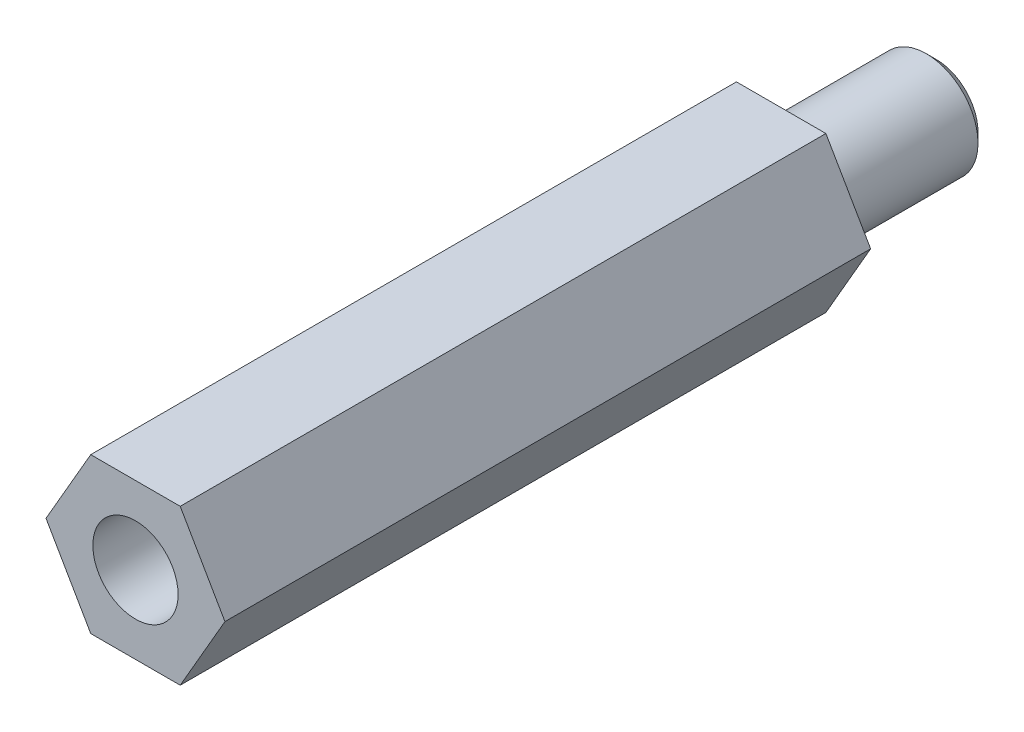
ISO-10303-21;
HEADER;
FILE_DESCRIPTION(('STEP AP214'),'2;1');
FILE_NAME('part.step','',(''),(''),'','','');
FILE_SCHEMA(('AUTOMOTIVE_DESIGN { 1 0 10303 214 1 1 1 1 }'));
ENDSEC;
DATA;
#1=APPLICATION_CONTEXT('core data for automotive mechanical design processes');
#2=APPLICATION_PROTOCOL_DEFINITION('international standard','automotive_design',2000,#1);
#3=PRODUCT_CONTEXT('',#1,'mechanical');
#4=PRODUCT('Part','Part','',(#3));
#5=PRODUCT_RELATED_PRODUCT_CATEGORY('part','',(#4));
#6=PRODUCT_DEFINITION_FORMATION('','',#4);
#7=PRODUCT_DEFINITION_CONTEXT('part definition',#1,'design');
#8=PRODUCT_DEFINITION('design','',#6,#7);
#9=PRODUCT_DEFINITION_SHAPE('','',#8);
#10=(LENGTH_UNIT() NAMED_UNIT(*) SI_UNIT(.MILLI.,.METRE.));
#11=(NAMED_UNIT(*) PLANE_ANGLE_UNIT() SI_UNIT($,.RADIAN.));
#12=(NAMED_UNIT(*) SI_UNIT($,.STERADIAN.) SOLID_ANGLE_UNIT());
#13=UNCERTAINTY_MEASURE_WITH_UNIT(LENGTH_MEASURE(1.E-05),#10,'distance_accuracy_value','');
#14=(GEOMETRIC_REPRESENTATION_CONTEXT(3) GLOBAL_UNCERTAINTY_ASSIGNED_CONTEXT((#13)) GLOBAL_UNIT_ASSIGNED_CONTEXT((#10,
#11,#12)) REPRESENTATION_CONTEXT('',''));
#15=CARTESIAN_POINT('',(0.,0.,0.));
#16=DIRECTION('',(0.,0.,1.));
#17=DIRECTION('',(1.,0.,0.));
#18=AXIS2_PLACEMENT_3D('',#15,#16,#17);
#19=CARTESIAN_POINT('',(-1.73205080756891,2.99999999999998,25.));
#20=DIRECTION('',(0.866025403784442,-0.499999999999995,0.));
#21=DIRECTION('',(0.499999999999995,0.866025403784442,0.));
#22=AXIS2_PLACEMENT_3D('',#19,#20,#21);
#23=PLANE('',#22);
#24=DIRECTION('',(-0.499999999999995,-0.866025403784441,0.));
#25=VECTOR('',#24,1.);
#26=CARTESIAN_POINT('',(-1.73205080756891,2.99999999999998,0.));
#27=LINE('',#26,#25);
#28=CARTESIAN_POINT('',(-1.73205080756891,2.99999999999998,0.));
#29=VERTEX_POINT('',#28);
#30=CARTESIAN_POINT('',(-3.46410161513776,0.,0.));
#31=VERTEX_POINT('',#30);
#32=EDGE_CURVE('E130',#29,#31,#27,.T.);
#33=ORIENTED_EDGE('',*,*,#32,.T.);
#34=DIRECTION('',(0.,0.,-1.));
#35=VECTOR('',#34,1.);
#36=CARTESIAN_POINT('',(-3.46410161513776,0.,25.));
#37=LINE('',#36,#35);
#38=CARTESIAN_POINT('',(-3.46410161513776,0.,25.));
#39=VERTEX_POINT('',#38);
#40=EDGE_CURVE('E45',#39,#31,#37,.T.);
#41=ORIENTED_EDGE('',*,*,#40,.F.);
#42=DIRECTION('',(-0.499999999999995,-0.866025403784441,0.));
#43=VECTOR('',#42,1.);
#44=CARTESIAN_POINT('',(-1.73205080756891,2.99999999999998,25.));
#45=LINE('',#44,#43);
#46=CARTESIAN_POINT('',(-1.73205080756891,2.99999999999998,25.));
#47=VERTEX_POINT('',#46);
#48=EDGE_CURVE('E141',#47,#39,#45,.T.);
#49=ORIENTED_EDGE('',*,*,#48,.F.);
#50=DIRECTION('',(0.,0.,-1.));
#51=VECTOR('',#50,1.);
#52=CARTESIAN_POINT('',(-1.73205080756891,2.99999999999998,25.));
#53=LINE('',#52,#51);
#54=EDGE_CURVE('E126',#47,#29,#53,.T.);
#55=ORIENTED_EDGE('',*,*,#54,.T.);
#56=EDGE_LOOP('',(#33,#41,#49,#55));
#57=FACE_BOUND('',#56,.T.);
#58=ADVANCED_FACE('F42',(#57),#23,.F.);
#59=CARTESIAN_POINT('',(-3.46410161513776,0.,25.));
#60=DIRECTION('',(0.866025403784438,0.500000000000001,0.));
#61=DIRECTION('',(-0.500000000000001,0.866025403784438,0.));
#62=AXIS2_PLACEMENT_3D('',#59,#60,#61);
#63=PLANE('',#62);
#64=DIRECTION('',(0.500000000000001,-0.866025403784438,0.));
#65=VECTOR('',#64,1.);
#66=CARTESIAN_POINT('',(-3.46410161513776,0.,0.));
#67=LINE('',#66,#65);
#68=CARTESIAN_POINT('',(-1.73205080756887,-3.00000000000001,0.));
#69=VERTEX_POINT('',#68);
#70=EDGE_CURVE('E133',#31,#69,#67,.T.);
#71=ORIENTED_EDGE('',*,*,#70,.T.);
#72=DIRECTION('',(0.,0.,-1.));
#73=VECTOR('',#72,1.);
#74=CARTESIAN_POINT('',(-1.73205080756887,-3.00000000000001,25.));
#75=LINE('',#74,#73);
#76=CARTESIAN_POINT('',(-1.73205080756887,-3.00000000000001,25.));
#77=VERTEX_POINT('',#76);
#78=EDGE_CURVE('E144',#77,#69,#75,.T.);
#79=ORIENTED_EDGE('',*,*,#78,.F.);
#80=DIRECTION('',(0.500000000000001,-0.866025403784438,0.));
#81=VECTOR('',#80,1.);
#82=CARTESIAN_POINT('',(-3.46410161513776,0.,25.));
#83=LINE('',#82,#81);
#84=EDGE_CURVE('E98',#39,#77,#83,.T.);
#85=ORIENTED_EDGE('',*,*,#84,.F.);
#86=ORIENTED_EDGE('',*,*,#40,.T.);
#87=EDGE_LOOP('',(#71,#79,#85,#86));
#88=FACE_BOUND('',#87,.T.);
#89=ADVANCED_FACE('F149',(#88),#63,.F.);
#90=CARTESIAN_POINT('',(-1.73205080756887,-3.00000000000001,25.));
#91=DIRECTION('',(0.,1.,0.));
#92=DIRECTION('',(-1.,0.,0.));
#93=AXIS2_PLACEMENT_3D('',#90,#91,#92);
#94=PLANE('',#93);
#95=DIRECTION('',(1.,0.,0.));
#96=VECTOR('',#95,1.);
#97=CARTESIAN_POINT('',(-1.73205080756887,-3.00000000000001,0.));
#98=LINE('',#97,#96);
#99=CARTESIAN_POINT('',(1.73205080756889,-2.99999999999999,0.));
#100=VERTEX_POINT('',#99);
#101=EDGE_CURVE('E136',#69,#100,#98,.T.);
#102=ORIENTED_EDGE('',*,*,#101,.T.);
#103=DIRECTION('',(0.,0.,-1.));
#104=VECTOR('',#103,1.);
#105=CARTESIAN_POINT('',(1.73205080756889,-2.99999999999999,25.));
#106=LINE('',#105,#104);
#107=CARTESIAN_POINT('',(1.73205080756889,-2.99999999999999,25.));
#108=VERTEX_POINT('',#107);
#109=EDGE_CURVE('E121',#108,#100,#106,.T.);
#110=ORIENTED_EDGE('',*,*,#109,.F.);
#111=DIRECTION('',(1.,0.,0.));
#112=VECTOR('',#111,1.);
#113=CARTESIAN_POINT('',(-1.73205080756887,-3.00000000000001,25.));
#114=LINE('',#113,#112);
#115=EDGE_CURVE('E112',#77,#108,#114,.T.);
#116=ORIENTED_EDGE('',*,*,#115,.F.);
#117=ORIENTED_EDGE('',*,*,#78,.T.);
#118=EDGE_LOOP('',(#102,#110,#116,#117));
#119=FACE_BOUND('',#118,.T.);
#120=ADVANCED_FACE('F155',(#119),#94,.F.);
#121=CARTESIAN_POINT('',(1.73205080756889,-2.99999999999999,25.));
#122=DIRECTION('',(-0.866025403784442,0.499999999999995,0.));
#123=DIRECTION('',(-0.499999999999995,-0.866025403784442,0.));
#124=AXIS2_PLACEMENT_3D('',#121,#122,#123);
#125=PLANE('',#124);
#126=DIRECTION('',(0.499999999999995,0.866025403784442,0.));
#127=VECTOR('',#126,1.);
#128=CARTESIAN_POINT('',(1.73205080756889,-2.99999999999999,0.));
#129=LINE('',#128,#127);
#130=CARTESIAN_POINT('',(3.46410161513776,0.,0.));
#131=VERTEX_POINT('',#130);
#132=EDGE_CURVE('E120',#100,#131,#129,.T.);
#133=ORIENTED_EDGE('',*,*,#132,.T.);
#134=DIRECTION('',(0.,0.,-1.));
#135=VECTOR('',#134,1.);
#136=CARTESIAN_POINT('',(3.46410161513776,0.,25.));
#137=LINE('',#136,#135);
#138=CARTESIAN_POINT('',(3.46410161513776,0.,25.));
#139=VERTEX_POINT('',#138);
#140=EDGE_CURVE('E117',#139,#131,#137,.T.);
#141=ORIENTED_EDGE('',*,*,#140,.F.);
#142=DIRECTION('',(0.499999999999995,0.866025403784442,0.));
#143=VECTOR('',#142,1.);
#144=CARTESIAN_POINT('',(1.73205080756889,-2.99999999999999,25.));
#145=LINE('',#144,#143);
#146=EDGE_CURVE('E106',#108,#139,#145,.T.);
#147=ORIENTED_EDGE('',*,*,#146,.F.);
#148=ORIENTED_EDGE('',*,*,#109,.T.);
#149=EDGE_LOOP('',(#133,#141,#147,#148));
#150=FACE_BOUND('',#149,.T.);
#151=ADVANCED_FACE('F118',(#150),#125,.F.);
#152=CARTESIAN_POINT('',(3.46410161513776,0.,25.));
#153=DIRECTION('',(-0.866025403784435,-0.500000000000007,0.));
#154=DIRECTION('',(0.500000000000007,-0.866025403784435,0.));
#155=AXIS2_PLACEMENT_3D('',#152,#153,#154);
#156=PLANE('',#155);
#157=DIRECTION('',(-0.500000000000007,0.866025403784435,0.));
#158=VECTOR('',#157,1.);
#159=CARTESIAN_POINT('',(3.46410161513776,0.,0.));
#160=LINE('',#159,#158);
#161=CARTESIAN_POINT('',(1.73205080756885,3.00000000000002,0.));
#162=VERTEX_POINT('',#161);
#163=EDGE_CURVE('E83',#131,#162,#160,.T.);
#164=ORIENTED_EDGE('',*,*,#163,.T.);
#165=DIRECTION('',(0.,0.,-1.));
#166=VECTOR('',#165,1.);
#167=CARTESIAN_POINT('',(1.73205080756885,3.00000000000002,25.));
#168=LINE('',#167,#166);
#169=CARTESIAN_POINT('',(1.73205080756885,3.00000000000002,25.));
#170=VERTEX_POINT('',#169);
#171=EDGE_CURVE('E122',#170,#162,#168,.T.);
#172=ORIENTED_EDGE('',*,*,#171,.F.);
#173=DIRECTION('',(-0.500000000000007,0.866025403784435,0.));
#174=VECTOR('',#173,1.);
#175=CARTESIAN_POINT('',(3.46410161513776,0.,25.));
#176=LINE('',#175,#174);
#177=EDGE_CURVE('E110',#139,#170,#176,.T.);
#178=ORIENTED_EDGE('',*,*,#177,.F.);
#179=ORIENTED_EDGE('',*,*,#140,.T.);
#180=EDGE_LOOP('',(#164,#172,#178,#179));
#181=FACE_BOUND('',#180,.T.);
#182=ADVANCED_FACE('F124',(#181),#156,.F.);
#183=CARTESIAN_POINT('',(1.73205080756885,3.00000000000002,25.));
#184=DIRECTION('',(0.,-1.,0.));
#185=DIRECTION('',(1.,0.,0.));
#186=AXIS2_PLACEMENT_3D('',#183,#184,#185);
#187=PLANE('',#186);
#188=DIRECTION('',(-1.,0.,0.));
#189=VECTOR('',#188,1.);
#190=CARTESIAN_POINT('',(1.73205080756885,3.00000000000002,0.));
#191=LINE('',#190,#189);
#192=EDGE_CURVE('E89',#162,#29,#191,.T.);
#193=ORIENTED_EDGE('',*,*,#192,.T.);
#194=ORIENTED_EDGE('',*,*,#54,.F.);
#195=DIRECTION('',(-1.,0.,0.));
#196=VECTOR('',#195,1.);
#197=CARTESIAN_POINT('',(1.73205080756885,3.00000000000002,25.));
#198=LINE('',#197,#196);
#199=EDGE_CURVE('E59',#170,#47,#198,.T.);
#200=ORIENTED_EDGE('',*,*,#199,.F.);
#201=ORIENTED_EDGE('',*,*,#171,.T.);
#202=EDGE_LOOP('',(#193,#194,#200,#201));
#203=FACE_BOUND('',#202,.T.);
#204=ADVANCED_FACE('F196',(#203),#187,.F.);
#205=CARTESIAN_POINT('',(0.,0.,25.));
#206=DIRECTION('',(0.,0.,1.));
#207=DIRECTION('',(1.,0.,0.));
#208=AXIS2_PLACEMENT_3D('',#205,#206,#207);
#209=PLANE('',#208);
#210=CARTESIAN_POINT('',(0.,0.,25.));
#211=DIRECTION('',(0.,0.,1.));
#212=DIRECTION('',(1.,0.,0.));
#213=AXIS2_PLACEMENT_3D('',#210,#211,#212);
#214=CIRCLE('',#213,1.64999999999999);
#215=CARTESIAN_POINT('',(1.64999999999999,0.,25.));
#216=VERTEX_POINT('',#215);
#217=EDGE_CURVE('E161',#216,#216,#214,.T.);
#218=ORIENTED_EDGE('',*,*,#217,.F.);
#219=EDGE_LOOP('',(#218));
#220=FACE_BOUND('',#219,.T.);
#221=ORIENTED_EDGE('',*,*,#48,.T.);
#222=ORIENTED_EDGE('',*,*,#84,.T.);
#223=ORIENTED_EDGE('',*,*,#115,.T.);
#224=ORIENTED_EDGE('',*,*,#146,.T.);
#225=ORIENTED_EDGE('',*,*,#177,.T.);
#226=ORIENTED_EDGE('',*,*,#199,.T.);
#227=EDGE_LOOP('',(#221,#222,#223,#224,#225,#226));
#228=FACE_BOUND('',#227,.T.);
#229=ADVANCED_FACE('F108',(#220,#228),#209,.T.);
#230=CARTESIAN_POINT('',(0.,0.,0.));
#231=DIRECTION('',(0.,0.,1.));
#232=DIRECTION('',(1.,0.,0.));
#233=AXIS2_PLACEMENT_3D('',#230,#231,#232);
#234=PLANE('',#233);
#235=CARTESIAN_POINT('',(0.,0.,0.));
#236=DIRECTION('',(0.,0.,-1.));
#237=DIRECTION('',(-1.,0.,0.));
#238=AXIS2_PLACEMENT_3D('',#235,#236,#237);
#239=CIRCLE('',#238,2.);
#240=CARTESIAN_POINT('',(-2.,0.,0.));
#241=VERTEX_POINT('',#240);
#242=EDGE_CURVE('E11',#241,#241,#239,.T.);
#243=ORIENTED_EDGE('',*,*,#242,.F.);
#244=EDGE_LOOP('',(#243));
#245=FACE_BOUND('',#244,.T.);
#246=ORIENTED_EDGE('',*,*,#32,.F.);
#247=ORIENTED_EDGE('',*,*,#192,.F.);
#248=ORIENTED_EDGE('',*,*,#163,.F.);
#249=ORIENTED_EDGE('',*,*,#132,.F.);
#250=ORIENTED_EDGE('',*,*,#101,.F.);
#251=ORIENTED_EDGE('',*,*,#70,.F.);
#252=EDGE_LOOP('',(#246,#247,#248,#249,#250,#251));
#253=FACE_BOUND('',#252,.T.);
#254=ADVANCED_FACE('F154',(#245,#253),#234,.F.);
#255=CARTESIAN_POINT('',(0.,0.,5.));
#256=DIRECTION('',(0.,0.,1.));
#257=DIRECTION('',(1.,0.,0.));
#258=AXIS2_PLACEMENT_3D('',#255,#256,#257);
#259=CONICAL_SURFACE('',#258,1.64999999999999,1.02974425867665);
#260=CARTESIAN_POINT('',(0.,0.,4.00857997860453));
#261=VERTEX_POINT('',#260);
#262=VERTEX_LOOP('',#261);
#263=FACE_BOUND('',#262,.T.);
#264=CARTESIAN_POINT('',(0.,0.,5.));
#265=DIRECTION('',(0.,0.,1.));
#266=DIRECTION('',(1.,0.,0.));
#267=AXIS2_PLACEMENT_3D('',#264,#265,#266);
#268=CIRCLE('',#267,1.64999999999999);
#269=CARTESIAN_POINT('',(1.64999999999999,0.,5.));
#270=VERTEX_POINT('',#269);
#271=EDGE_CURVE('E134',#270,#270,#268,.T.);
#272=ORIENTED_EDGE('',*,*,#271,.T.);
#273=EDGE_LOOP('',(#272));
#274=FACE_BOUND('',#273,.T.);
#275=ADVANCED_FACE('F201',(#263,#274),#259,.F.);
#276=CARTESIAN_POINT('',(0.,0.,25.));
#277=DIRECTION('',(0.,0.,1.));
#278=DIRECTION('',(1.,0.,0.));
#279=AXIS2_PLACEMENT_3D('',#276,#277,#278);
#280=CYLINDRICAL_SURFACE('',#279,1.64999999999999);
#281=ORIENTED_EDGE('',*,*,#271,.F.);
#282=EDGE_LOOP('',(#281));
#283=FACE_BOUND('',#282,.T.);
#284=ORIENTED_EDGE('',*,*,#217,.T.);
#285=EDGE_LOOP('',(#284));
#286=FACE_BOUND('',#285,.T.);
#287=ADVANCED_FACE('F208',(#283,#286),#280,.F.);
#288=CARTESIAN_POINT('',(0.,0.,-6.));
#289=DIRECTION('',(0.,0.,1.));
#290=DIRECTION('',(1.,0.,0.));
#291=AXIS2_PLACEMENT_3D('',#288,#289,#290);
#292=CYLINDRICAL_SURFACE('',#291,2.);
#293=CARTESIAN_POINT('',(0.,0.,-5.62100000000001));
#294=DIRECTION('',(0.,0.,1.));
#295=DIRECTION('',(1.,0.,0.));
#296=AXIS2_PLACEMENT_3D('',#293,#294,#295);
#297=CIRCLE('',#296,1.99999999999999);
#298=CARTESIAN_POINT('',(1.99999999999999,0.,-5.62100000000001));
#299=VERTEX_POINT('',#298);
#300=EDGE_CURVE('E163',#299,#299,#297,.T.);
#301=ORIENTED_EDGE('',*,*,#300,.T.);
#302=EDGE_LOOP('',(#301));
#303=FACE_BOUND('',#302,.T.);
#304=ORIENTED_EDGE('',*,*,#242,.T.);
#305=EDGE_LOOP('',(#304));
#306=FACE_BOUND('',#305,.T.);
#307=ADVANCED_FACE('F179',(#303,#306),#292,.T.);
#308=CARTESIAN_POINT('',(0.,0.,-6.));
#309=DIRECTION('',(0.,0.,1.));
#310=DIRECTION('',(1.,0.,0.));
#311=AXIS2_PLACEMENT_3D('',#308,#309,#310);
#312=CONICAL_SURFACE('',#311,1.621,0.785398163397445);
#313=ORIENTED_EDGE('',*,*,#300,.F.);
#314=EDGE_LOOP('',(#313));
#315=FACE_BOUND('',#314,.T.);
#316=CARTESIAN_POINT('',(0.,0.,-6.));
#317=DIRECTION('',(0.,0.,1.));
#318=DIRECTION('',(1.,0.,0.));
#319=AXIS2_PLACEMENT_3D('',#316,#317,#318);
#320=CIRCLE('',#319,1.621);
#321=CARTESIAN_POINT('',(1.621,0.,-6.));
#322=VERTEX_POINT('',#321);
#323=EDGE_CURVE('E167',#322,#322,#320,.T.);
#324=ORIENTED_EDGE('',*,*,#323,.T.);
#325=EDGE_LOOP('',(#324));
#326=FACE_BOUND('',#325,.T.);
#327=ADVANCED_FACE('F171',(#315,#326),#312,.T.);
#328=CARTESIAN_POINT('',(0.,0.,-6.));
#329=DIRECTION('',(0.,0.,-1.));
#330=DIRECTION('',(-1.,0.,0.));
#331=AXIS2_PLACEMENT_3D('',#328,#329,#330);
#332=PLANE('',#331);
#333=ORIENTED_EDGE('',*,*,#323,.F.);
#334=EDGE_LOOP('',(#333));
#335=FACE_BOUND('',#334,.T.);
#336=ADVANCED_FACE('F173',(#335),#332,.T.);
#337=CLOSED_SHELL('',(#58,#89,#120,#151,#182,#204,#229,#254,#275,#287,#307,#327,#336));
#338=MANIFOLD_SOLID_BREP('B2',#337);
#339=ADVANCED_BREP_SHAPE_REPRESENTATION('',(#18,#338),#14);
#340=SHAPE_DEFINITION_REPRESENTATION(#9,#339);
ENDSEC;
END-ISO-10303-21;
